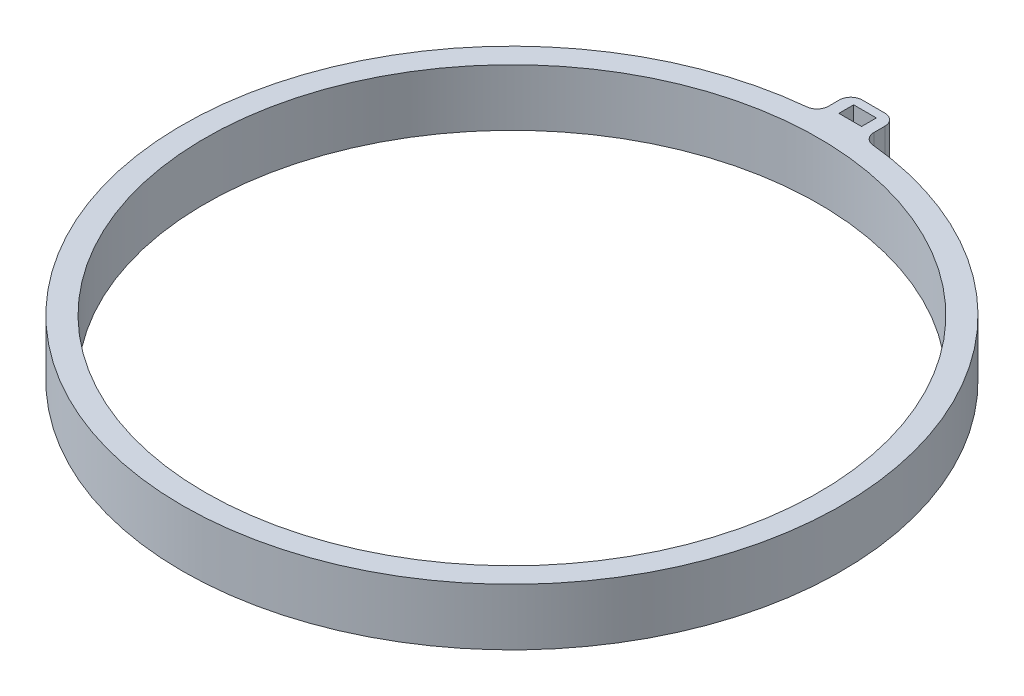
ISO-10303-21;
HEADER;
FILE_DESCRIPTION(('STEP AP214'),'2;1');
FILE_NAME('part.step','',(''),(''),'','','');
FILE_SCHEMA(('AUTOMOTIVE_DESIGN { 1 0 10303 214 1 1 1 1 }'));
ENDSEC;
DATA;
#1=APPLICATION_CONTEXT('core data for automotive mechanical design processes');
#2=APPLICATION_PROTOCOL_DEFINITION('international standard','automotive_design',2000,#1);
#3=PRODUCT_CONTEXT('',#1,'mechanical');
#4=PRODUCT('Part','Part','',(#3));
#5=PRODUCT_RELATED_PRODUCT_CATEGORY('part','',(#4));
#6=PRODUCT_DEFINITION_FORMATION('','',#4);
#7=PRODUCT_DEFINITION_CONTEXT('part definition',#1,'design');
#8=PRODUCT_DEFINITION('design','',#6,#7);
#9=PRODUCT_DEFINITION_SHAPE('','',#8);
#10=(LENGTH_UNIT() NAMED_UNIT(*) SI_UNIT(.MILLI.,.METRE.));
#11=(NAMED_UNIT(*) PLANE_ANGLE_UNIT() SI_UNIT($,.RADIAN.));
#12=(NAMED_UNIT(*) SI_UNIT($,.STERADIAN.) SOLID_ANGLE_UNIT());
#13=UNCERTAINTY_MEASURE_WITH_UNIT(LENGTH_MEASURE(1.E-05),#10,'distance_accuracy_value','');
#14=(GEOMETRIC_REPRESENTATION_CONTEXT(3) GLOBAL_UNCERTAINTY_ASSIGNED_CONTEXT((#13)) GLOBAL_UNIT_ASSIGNED_CONTEXT((#10,
#11,#12)) REPRESENTATION_CONTEXT('',''));
#15=CARTESIAN_POINT('',(0.,0.,0.));
#16=DIRECTION('',(0.,0.,1.));
#17=DIRECTION('',(1.,0.,0.));
#18=AXIS2_PLACEMENT_3D('',#15,#16,#17);
#19=CARTESIAN_POINT('',(0.,5.,0.));
#20=DIRECTION('',(0.,1.,0.));
#21=DIRECTION('',(0.,0.,1.));
#22=AXIS2_PLACEMENT_3D('',#19,#20,#21);
#23=PLANE('',#22);
#24=DIRECTION('',(0.,0.,1.));
#25=VECTOR('',#24,1.);
#26=CARTESIAN_POINT('',(0.999999999999997,5.,-31.0686114081169));
#27=LINE('',#26,#25);
#28=CARTESIAN_POINT('',(0.999999999999997,5.,-31.0686114081169));
#29=VERTEX_POINT('',#28);
#30=CARTESIAN_POINT('',(0.999999999999997,5.,-29.7662195960251));
#31=VERTEX_POINT('',#30);
#32=EDGE_CURVE('E124',#29,#31,#27,.T.);
#33=ORIENTED_EDGE('',*,*,#32,.T.);
#34=DIRECTION('',(-1.,0.,0.));
#35=VECTOR('',#34,1.);
#36=CARTESIAN_POINT('',(-1.,5.,-29.7662195960251));
#37=LINE('',#36,#35);
#38=CARTESIAN_POINT('',(-1.,5.,-29.7662195960251));
#39=VERTEX_POINT('',#38);
#40=EDGE_CURVE('E133',#31,#39,#37,.T.);
#41=ORIENTED_EDGE('',*,*,#40,.T.);
#42=DIRECTION('',(0.,0.,-1.));
#43=VECTOR('',#42,1.);
#44=CARTESIAN_POINT('',(-1.,5.,-31.0686114081169));
#45=LINE('',#44,#43);
#46=CARTESIAN_POINT('',(-1.,5.,-31.0686114081169));
#47=VERTEX_POINT('',#46);
#48=EDGE_CURVE('E49',#39,#47,#45,.T.);
#49=ORIENTED_EDGE('',*,*,#48,.T.);
#50=DIRECTION('',(1.,0.,0.));
#51=VECTOR('',#50,1.);
#52=CARTESIAN_POINT('',(-1.,5.,-31.0686114081169));
#53=LINE('',#52,#51);
#54=EDGE_CURVE('E130',#47,#29,#53,.T.);
#55=ORIENTED_EDGE('',*,*,#54,.T.);
#56=EDGE_LOOP('',(#33,#41,#49,#55));
#57=FACE_BOUND('',#56,.T.);
#58=DIRECTION('',(0.,0.,-1.));
#59=VECTOR('',#58,1.);
#60=CARTESIAN_POINT('',(2.,5.,-31.8144785310325));
#61=LINE('',#60,#59);
#62=CARTESIAN_POINT('',(2.,5.,-29.8496231131986));
#63=VERTEX_POINT('',#62);
#64=CARTESIAN_POINT('',(2.,5.,-30.8144785310325));
#65=VERTEX_POINT('',#64);
#66=EDGE_CURVE('E154',#63,#65,#61,.T.);
#67=ORIENTED_EDGE('',*,*,#66,.T.);
#68=CARTESIAN_POINT('',(0.999999999999997,5.,-30.8144785310325));
#69=DIRECTION('',(0.,1.,0.));
#70=DIRECTION('',(0.,0.,1.));
#71=AXIS2_PLACEMENT_3D('',#68,#69,#70);
#72=CIRCLE('',#71,1.);
#73=CARTESIAN_POINT('',(0.999999999999997,5.,-31.8144785310325));
#74=VERTEX_POINT('',#73);
#75=EDGE_CURVE('E204',#65,#74,#72,.T.);
#76=ORIENTED_EDGE('',*,*,#75,.T.);
#77=DIRECTION('',(-1.,0.,0.));
#78=VECTOR('',#77,1.);
#79=CARTESIAN_POINT('',(-2.,5.,-31.8144785310325));
#80=LINE('',#79,#78);
#81=CARTESIAN_POINT('',(-1.,5.,-31.8144785310325));
#82=VERTEX_POINT('',#81);
#83=EDGE_CURVE('E171',#74,#82,#80,.T.);
#84=ORIENTED_EDGE('',*,*,#83,.T.);
#85=CARTESIAN_POINT('',(-1.,5.,-30.8144785310325));
#86=DIRECTION('',(0.,1.,0.));
#87=DIRECTION('',(0.,0.,1.));
#88=AXIS2_PLACEMENT_3D('',#85,#86,#87);
#89=CIRCLE('',#88,1.);
#90=CARTESIAN_POINT('',(-2.,5.,-30.8144785310325));
#91=VERTEX_POINT('',#90);
#92=EDGE_CURVE('E202',#82,#91,#89,.T.);
#93=ORIENTED_EDGE('',*,*,#92,.T.);
#94=DIRECTION('',(0.,0.,1.));
#95=VECTOR('',#94,1.);
#96=CARTESIAN_POINT('',(-2.,5.,-31.8144785310325));
#97=LINE('',#96,#95);
#98=CARTESIAN_POINT('',(-2.,5.,-29.8496231131986));
#99=VERTEX_POINT('',#98);
#100=EDGE_CURVE('E162',#91,#99,#97,.T.);
#101=ORIENTED_EDGE('',*,*,#100,.T.);
#102=CARTESIAN_POINT('',(-3.,5.,-29.8496231131986));
#103=DIRECTION('',(0.,1.,0.));
#104=DIRECTION('',(0.,0.,1.));
#105=AXIS2_PLACEMENT_3D('',#102,#103,#104);
#106=CIRCLE('',#105,1.);
#107=CARTESIAN_POINT('',(-2.9,5.,-28.854635676092));
#108=VERTEX_POINT('',#107);
#109=EDGE_CURVE('E11',#99,#108,#106,.F.);
#110=ORIENTED_EDGE('',*,*,#109,.T.);
#111=CARTESIAN_POINT('',(0.,5.,0.));
#112=DIRECTION('',(0.,1.,0.));
#113=DIRECTION('',(0.,0.,1.));
#114=AXIS2_PLACEMENT_3D('',#111,#112,#113);
#115=CIRCLE('',#114,29.);
#116=CARTESIAN_POINT('',(2.9,5.,-28.854635676092));
#117=VERTEX_POINT('',#116);
#118=EDGE_CURVE('E182',#108,#117,#115,.T.);
#119=ORIENTED_EDGE('',*,*,#118,.T.);
#120=CARTESIAN_POINT('',(3.,5.,-29.8496231131986));
#121=DIRECTION('',(0.,1.,0.));
#122=DIRECTION('',(0.,0.,1.));
#123=AXIS2_PLACEMENT_3D('',#120,#121,#122);
#124=CIRCLE('',#123,1.);
#125=EDGE_CURVE('E215',#117,#63,#124,.F.);
#126=ORIENTED_EDGE('',*,*,#125,.T.);
#127=EDGE_LOOP('',(#67,#76,#84,#93,#101,#110,#119,#126));
#128=FACE_BOUND('',#127,.T.);
#129=CARTESIAN_POINT('',(0.,5.,0.));
#130=DIRECTION('',(0.,1.,0.));
#131=DIRECTION('',(0.,0.,1.));
#132=AXIS2_PLACEMENT_3D('',#129,#130,#131);
#133=CIRCLE('',#132,27.);
#134=CARTESIAN_POINT('',(0.,5.,27.));
#135=VERTEX_POINT('',#134);
#136=EDGE_CURVE('E176',#135,#135,#133,.T.);
#137=ORIENTED_EDGE('',*,*,#136,.F.);
#138=EDGE_LOOP('',(#137));
#139=FACE_BOUND('',#138,.T.);
#140=ADVANCED_FACE('F34',(#57,#128,#139),#23,.T.);
#141=CARTESIAN_POINT('',(0.,0.,0.));
#142=DIRECTION('',(0.,1.,0.));
#143=DIRECTION('',(0.,0.,1.));
#144=AXIS2_PLACEMENT_3D('',#141,#142,#143);
#145=PLANE('',#144);
#146=DIRECTION('',(-1.,0.,0.));
#147=VECTOR('',#146,1.);
#148=CARTESIAN_POINT('',(-1.,0.,-29.7662195960251));
#149=LINE('',#148,#147);
#150=CARTESIAN_POINT('',(0.999999999999997,0.,-29.7662195960251));
#151=VERTEX_POINT('',#150);
#152=CARTESIAN_POINT('',(-1.,0.,-29.7662195960251));
#153=VERTEX_POINT('',#152);
#154=EDGE_CURVE('E148',#151,#153,#149,.T.);
#155=ORIENTED_EDGE('',*,*,#154,.F.);
#156=DIRECTION('',(0.,0.,1.));
#157=VECTOR('',#156,1.);
#158=CARTESIAN_POINT('',(0.999999999999997,0.,-31.0686114081169));
#159=LINE('',#158,#157);
#160=CARTESIAN_POINT('',(0.999999999999997,0.,-31.0686114081169));
#161=VERTEX_POINT('',#160);
#162=EDGE_CURVE('E57',#161,#151,#159,.T.);
#163=ORIENTED_EDGE('',*,*,#162,.F.);
#164=DIRECTION('',(1.,0.,0.));
#165=VECTOR('',#164,1.);
#166=CARTESIAN_POINT('',(-1.,0.,-31.0686114081169));
#167=LINE('',#166,#165);
#168=CARTESIAN_POINT('',(-1.,0.,-31.0686114081169));
#169=VERTEX_POINT('',#168);
#170=EDGE_CURVE('E139',#169,#161,#167,.T.);
#171=ORIENTED_EDGE('',*,*,#170,.F.);
#172=DIRECTION('',(0.,0.,-1.));
#173=VECTOR('',#172,1.);
#174=CARTESIAN_POINT('',(-1.,0.,-31.0686114081169));
#175=LINE('',#174,#173);
#176=EDGE_CURVE('E142',#153,#169,#175,.T.);
#177=ORIENTED_EDGE('',*,*,#176,.F.);
#178=EDGE_LOOP('',(#155,#163,#171,#177));
#179=FACE_BOUND('',#178,.T.);
#180=DIRECTION('',(-1.,0.,0.));
#181=VECTOR('',#180,1.);
#182=CARTESIAN_POINT('',(-2.,0.,-31.8144785310325));
#183=LINE('',#182,#181);
#184=CARTESIAN_POINT('',(0.999999999999997,0.,-31.8144785310325));
#185=VERTEX_POINT('',#184);
#186=CARTESIAN_POINT('',(-1.,0.,-31.8144785310325));
#187=VERTEX_POINT('',#186);
#188=EDGE_CURVE('E161',#185,#187,#183,.T.);
#189=ORIENTED_EDGE('',*,*,#188,.F.);
#190=CARTESIAN_POINT('',(0.999999999999997,0.,-30.8144785310325));
#191=DIRECTION('',(0.,1.,0.));
#192=DIRECTION('',(0.,0.,1.));
#193=AXIS2_PLACEMENT_3D('',#190,#191,#192);
#194=CIRCLE('',#193,1.);
#195=CARTESIAN_POINT('',(2.,0.,-30.8144785310325));
#196=VERTEX_POINT('',#195);
#197=EDGE_CURVE('E213',#185,#196,#194,.F.);
#198=ORIENTED_EDGE('',*,*,#197,.T.);
#199=DIRECTION('',(0.,0.,-1.));
#200=VECTOR('',#199,1.);
#201=CARTESIAN_POINT('',(2.,0.,-31.8144785310325));
#202=LINE('',#201,#200);
#203=CARTESIAN_POINT('',(2.,0.,-29.8496231131986));
#204=VERTEX_POINT('',#203);
#205=EDGE_CURVE('E158',#204,#196,#202,.T.);
#206=ORIENTED_EDGE('',*,*,#205,.F.);
#207=CARTESIAN_POINT('',(3.,0.,-29.8496231131986));
#208=DIRECTION('',(0.,1.,0.));
#209=DIRECTION('',(0.,0.,1.));
#210=AXIS2_PLACEMENT_3D('',#207,#208,#209);
#211=CIRCLE('',#210,1.);
#212=CARTESIAN_POINT('',(2.9,0.,-28.854635676092));
#213=VERTEX_POINT('',#212);
#214=EDGE_CURVE('E217',#204,#213,#211,.T.);
#215=ORIENTED_EDGE('',*,*,#214,.T.);
#216=CARTESIAN_POINT('',(0.,0.,0.));
#217=DIRECTION('',(0.,1.,0.));
#218=DIRECTION('',(0.,0.,1.));
#219=AXIS2_PLACEMENT_3D('',#216,#217,#218);
#220=CIRCLE('',#219,29.);
#221=CARTESIAN_POINT('',(-2.9,0.,-28.854635676092));
#222=VERTEX_POINT('',#221);
#223=EDGE_CURVE('E179',#222,#213,#220,.T.);
#224=ORIENTED_EDGE('',*,*,#223,.F.);
#225=CARTESIAN_POINT('',(-3.,0.,-29.8496231131986));
#226=DIRECTION('',(0.,1.,0.));
#227=DIRECTION('',(0.,0.,1.));
#228=AXIS2_PLACEMENT_3D('',#225,#226,#227);
#229=CIRCLE('',#228,1.);
#230=CARTESIAN_POINT('',(-2.,0.,-29.8496231131986));
#231=VERTEX_POINT('',#230);
#232=EDGE_CURVE('E42',#222,#231,#229,.T.);
#233=ORIENTED_EDGE('',*,*,#232,.T.);
#234=DIRECTION('',(0.,0.,1.));
#235=VECTOR('',#234,1.);
#236=CARTESIAN_POINT('',(-2.,0.,-31.8144785310325));
#237=LINE('',#236,#235);
#238=CARTESIAN_POINT('',(-2.,0.,-30.8144785310325));
#239=VERTEX_POINT('',#238);
#240=EDGE_CURVE('E165',#239,#231,#237,.T.);
#241=ORIENTED_EDGE('',*,*,#240,.F.);
#242=CARTESIAN_POINT('',(-1.,0.,-30.8144785310325));
#243=DIRECTION('',(0.,1.,0.));
#244=DIRECTION('',(0.,0.,1.));
#245=AXIS2_PLACEMENT_3D('',#242,#243,#244);
#246=CIRCLE('',#245,1.);
#247=EDGE_CURVE('E211',#239,#187,#246,.F.);
#248=ORIENTED_EDGE('',*,*,#247,.T.);
#249=EDGE_LOOP('',(#189,#198,#206,#215,#224,#233,#241,#248));
#250=FACE_BOUND('',#249,.T.);
#251=CARTESIAN_POINT('',(0.,0.,0.));
#252=DIRECTION('',(0.,1.,0.));
#253=DIRECTION('',(0.,0.,1.));
#254=AXIS2_PLACEMENT_3D('',#251,#252,#253);
#255=CIRCLE('',#254,27.);
#256=CARTESIAN_POINT('',(0.,0.,27.));
#257=VERTEX_POINT('',#256);
#258=EDGE_CURVE('E168',#257,#257,#255,.T.);
#259=ORIENTED_EDGE('',*,*,#258,.T.);
#260=EDGE_LOOP('',(#259));
#261=FACE_BOUND('',#260,.T.);
#262=ADVANCED_FACE('F222',(#179,#250,#261),#145,.F.);
#263=CARTESIAN_POINT('',(0.,5.,0.));
#264=DIRECTION('',(0.,-1.,0.));
#265=DIRECTION('',(0.,0.,-1.));
#266=AXIS2_PLACEMENT_3D('',#263,#264,#265);
#267=CYLINDRICAL_SURFACE('',#266,29.);
#268=ORIENTED_EDGE('',*,*,#223,.T.);
#269=DIRECTION('',(0.,-1.,0.));
#270=VECTOR('',#269,1.);
#271=CARTESIAN_POINT('',(2.9,5.,-28.854635676092));
#272=LINE('',#271,#270);
#273=EDGE_CURVE('E190',#213,#117,#272,.F.);
#274=ORIENTED_EDGE('',*,*,#273,.T.);
#275=ORIENTED_EDGE('',*,*,#118,.F.);
#276=DIRECTION('',(0.,-1.,0.));
#277=VECTOR('',#276,1.);
#278=CARTESIAN_POINT('',(-2.9,5.,-28.854635676092));
#279=LINE('',#278,#277);
#280=EDGE_CURVE('E185',#108,#222,#279,.T.);
#281=ORIENTED_EDGE('',*,*,#280,.T.);
#282=EDGE_LOOP('',(#268,#274,#275,#281));
#283=FACE_BOUND('',#282,.T.);
#284=ADVANCED_FACE('F237',(#283),#267,.T.);
#285=CARTESIAN_POINT('',(0.,5.,0.));
#286=DIRECTION('',(0.,-1.,0.));
#287=DIRECTION('',(0.,0.,-1.));
#288=AXIS2_PLACEMENT_3D('',#285,#286,#287);
#289=CYLINDRICAL_SURFACE('',#288,27.);
#290=ORIENTED_EDGE('',*,*,#136,.T.);
#291=EDGE_LOOP('',(#290));
#292=FACE_BOUND('',#291,.T.);
#293=ORIENTED_EDGE('',*,*,#258,.F.);
#294=EDGE_LOOP('',(#293));
#295=FACE_BOUND('',#294,.T.);
#296=ADVANCED_FACE('F272',(#292,#295),#289,.F.);
#297=CARTESIAN_POINT('',(2.,0.,-31.8144785310325));
#298=DIRECTION('',(1.,0.,0.));
#299=DIRECTION('',(0.,0.,-1.));
#300=AXIS2_PLACEMENT_3D('',#297,#298,#299);
#301=PLANE('',#300);
#302=ORIENTED_EDGE('',*,*,#66,.F.);
#303=DIRECTION('',(0.,-1.,0.));
#304=VECTOR('',#303,1.);
#305=CARTESIAN_POINT('',(2.,0.,-29.8496231131986));
#306=LINE('',#305,#304);
#307=EDGE_CURVE('E196',#63,#204,#306,.T.);
#308=ORIENTED_EDGE('',*,*,#307,.T.);
#309=ORIENTED_EDGE('',*,*,#205,.T.);
#310=DIRECTION('',(0.,1.,0.));
#311=VECTOR('',#310,1.);
#312=CARTESIAN_POINT('',(2.,0.,-30.8144785310325));
#313=LINE('',#312,#311);
#314=EDGE_CURVE('E193',#196,#65,#313,.T.);
#315=ORIENTED_EDGE('',*,*,#314,.T.);
#316=EDGE_LOOP('',(#302,#308,#309,#315));
#317=FACE_BOUND('',#316,.T.);
#318=ADVANCED_FACE('F245',(#317),#301,.T.);
#319=CARTESIAN_POINT('',(-2.,0.,-31.8144785310325));
#320=DIRECTION('',(-1.,0.,0.));
#321=DIRECTION('',(0.,0.,1.));
#322=AXIS2_PLACEMENT_3D('',#319,#320,#321);
#323=PLANE('',#322);
#324=ORIENTED_EDGE('',*,*,#240,.T.);
#325=DIRECTION('',(0.,-1.,0.));
#326=VECTOR('',#325,1.);
#327=CARTESIAN_POINT('',(-2.,0.,-29.8496231131986));
#328=LINE('',#327,#326);
#329=EDGE_CURVE('E200',#231,#99,#328,.F.);
#330=ORIENTED_EDGE('',*,*,#329,.T.);
#331=ORIENTED_EDGE('',*,*,#100,.F.);
#332=DIRECTION('',(0.,1.,0.));
#333=VECTOR('',#332,1.);
#334=CARTESIAN_POINT('',(-2.,0.,-30.8144785310325));
#335=LINE('',#334,#333);
#336=EDGE_CURVE('E198',#91,#239,#335,.F.);
#337=ORIENTED_EDGE('',*,*,#336,.T.);
#338=EDGE_LOOP('',(#324,#330,#331,#337));
#339=FACE_BOUND('',#338,.T.);
#340=ADVANCED_FACE('F229',(#339),#323,.T.);
#341=CARTESIAN_POINT('',(-2.,0.,-31.8144785310325));
#342=DIRECTION('',(0.,0.,-1.));
#343=DIRECTION('',(-1.,0.,0.));
#344=AXIS2_PLACEMENT_3D('',#341,#342,#343);
#345=PLANE('',#344);
#346=ORIENTED_EDGE('',*,*,#83,.F.);
#347=DIRECTION('',(0.,1.,0.));
#348=VECTOR('',#347,1.);
#349=CARTESIAN_POINT('',(0.999999999999997,0.,-31.8144785310325));
#350=LINE('',#349,#348);
#351=EDGE_CURVE('E209',#74,#185,#350,.F.);
#352=ORIENTED_EDGE('',*,*,#351,.T.);
#353=ORIENTED_EDGE('',*,*,#188,.T.);
#354=DIRECTION('',(0.,1.,0.));
#355=VECTOR('',#354,1.);
#356=CARTESIAN_POINT('',(-1.,0.,-31.8144785310325));
#357=LINE('',#356,#355);
#358=EDGE_CURVE('E206',#187,#82,#357,.T.);
#359=ORIENTED_EDGE('',*,*,#358,.T.);
#360=EDGE_LOOP('',(#346,#352,#353,#359));
#361=FACE_BOUND('',#360,.T.);
#362=ADVANCED_FACE('F254',(#361),#345,.T.);
#363=CARTESIAN_POINT('',(3.,5.,-29.8496231131986));
#364=DIRECTION('',(0.,-1.,0.));
#365=DIRECTION('',(0.,0.,-1.));
#366=AXIS2_PLACEMENT_3D('',#363,#364,#365);
#367=CYLINDRICAL_SURFACE('',#366,1.);
#368=ORIENTED_EDGE('',*,*,#214,.F.);
#369=ORIENTED_EDGE('',*,*,#307,.F.);
#370=ORIENTED_EDGE('',*,*,#125,.F.);
#371=ORIENTED_EDGE('',*,*,#273,.F.);
#372=EDGE_LOOP('',(#368,#369,#370,#371));
#373=FACE_BOUND('',#372,.T.);
#374=ADVANCED_FACE('F241',(#373),#367,.F.);
#375=CARTESIAN_POINT('',(-3.,5.,-29.8496231131986));
#376=DIRECTION('',(0.,-1.,0.));
#377=DIRECTION('',(0.,0.,-1.));
#378=AXIS2_PLACEMENT_3D('',#375,#376,#377);
#379=CYLINDRICAL_SURFACE('',#378,1.);
#380=ORIENTED_EDGE('',*,*,#109,.F.);
#381=ORIENTED_EDGE('',*,*,#329,.F.);
#382=ORIENTED_EDGE('',*,*,#232,.F.);
#383=ORIENTED_EDGE('',*,*,#280,.F.);
#384=EDGE_LOOP('',(#380,#381,#382,#383));
#385=FACE_BOUND('',#384,.T.);
#386=ADVANCED_FACE('F233',(#385),#379,.F.);
#387=CARTESIAN_POINT('',(0.999999999999997,0.,-30.8144785310325));
#388=DIRECTION('',(0.,1.,0.));
#389=DIRECTION('',(0.,0.,1.));
#390=AXIS2_PLACEMENT_3D('',#387,#388,#389);
#391=CYLINDRICAL_SURFACE('',#390,1.);
#392=ORIENTED_EDGE('',*,*,#197,.F.);
#393=ORIENTED_EDGE('',*,*,#351,.F.);
#394=ORIENTED_EDGE('',*,*,#75,.F.);
#395=ORIENTED_EDGE('',*,*,#314,.F.);
#396=EDGE_LOOP('',(#392,#393,#394,#395));
#397=FACE_BOUND('',#396,.T.);
#398=ADVANCED_FACE('F250',(#397),#391,.T.);
#399=CARTESIAN_POINT('',(-1.,0.,-30.8144785310325));
#400=DIRECTION('',(0.,1.,0.));
#401=DIRECTION('',(0.,0.,1.));
#402=AXIS2_PLACEMENT_3D('',#399,#400,#401);
#403=CYLINDRICAL_SURFACE('',#402,1.);
#404=ORIENTED_EDGE('',*,*,#247,.F.);
#405=ORIENTED_EDGE('',*,*,#336,.F.);
#406=ORIENTED_EDGE('',*,*,#92,.F.);
#407=ORIENTED_EDGE('',*,*,#358,.F.);
#408=EDGE_LOOP('',(#404,#405,#406,#407));
#409=FACE_BOUND('',#408,.T.);
#410=ADVANCED_FACE('F36',(#409),#403,.T.);
#411=CARTESIAN_POINT('',(0.999999999999997,5.,-31.0686114081169));
#412=DIRECTION('',(1.,0.,0.));
#413=DIRECTION('',(0.,0.,-1.));
#414=AXIS2_PLACEMENT_3D('',#411,#412,#413);
#415=PLANE('',#414);
#416=ORIENTED_EDGE('',*,*,#162,.T.);
#417=DIRECTION('',(0.,-1.,0.));
#418=VECTOR('',#417,1.);
#419=CARTESIAN_POINT('',(0.999999999999997,5.,-29.7662195960251));
#420=LINE('',#419,#418);
#421=EDGE_CURVE('E120',#31,#151,#420,.T.);
#422=ORIENTED_EDGE('',*,*,#421,.F.);
#423=ORIENTED_EDGE('',*,*,#32,.F.);
#424=DIRECTION('',(0.,-1.,0.));
#425=VECTOR('',#424,1.);
#426=CARTESIAN_POINT('',(0.999999999999997,5.,-31.0686114081169));
#427=LINE('',#426,#425);
#428=EDGE_CURVE('E152',#29,#161,#427,.T.);
#429=ORIENTED_EDGE('',*,*,#428,.T.);
#430=EDGE_LOOP('',(#416,#422,#423,#429));
#431=FACE_BOUND('',#430,.T.);
#432=ADVANCED_FACE('F122',(#431),#415,.F.);
#433=CARTESIAN_POINT('',(-1.,5.,-31.0686114081169));
#434=DIRECTION('',(0.,0.,-1.));
#435=DIRECTION('',(-1.,0.,0.));
#436=AXIS2_PLACEMENT_3D('',#433,#434,#435);
#437=PLANE('',#436);
#438=ORIENTED_EDGE('',*,*,#170,.T.);
#439=ORIENTED_EDGE('',*,*,#428,.F.);
#440=ORIENTED_EDGE('',*,*,#54,.F.);
#441=DIRECTION('',(0.,-1.,0.));
#442=VECTOR('',#441,1.);
#443=CARTESIAN_POINT('',(-1.,5.,-31.0686114081169));
#444=LINE('',#443,#442);
#445=EDGE_CURVE('E155',#47,#169,#444,.T.);
#446=ORIENTED_EDGE('',*,*,#445,.T.);
#447=EDGE_LOOP('',(#438,#439,#440,#446));
#448=FACE_BOUND('',#447,.T.);
#449=ADVANCED_FACE('F262',(#448),#437,.F.);
#450=CARTESIAN_POINT('',(-1.,5.,-31.0686114081169));
#451=DIRECTION('',(-1.,0.,0.));
#452=DIRECTION('',(0.,0.,1.));
#453=AXIS2_PLACEMENT_3D('',#450,#451,#452);
#454=PLANE('',#453);
#455=ORIENTED_EDGE('',*,*,#176,.T.);
#456=ORIENTED_EDGE('',*,*,#445,.F.);
#457=ORIENTED_EDGE('',*,*,#48,.F.);
#458=DIRECTION('',(0.,-1.,0.));
#459=VECTOR('',#458,1.);
#460=CARTESIAN_POINT('',(-1.,5.,-29.7662195960251));
#461=LINE('',#460,#459);
#462=EDGE_CURVE('E129',#39,#153,#461,.T.);
#463=ORIENTED_EDGE('',*,*,#462,.T.);
#464=EDGE_LOOP('',(#455,#456,#457,#463));
#465=FACE_BOUND('',#464,.T.);
#466=ADVANCED_FACE('F322',(#465),#454,.F.);
#467=CARTESIAN_POINT('',(-1.,5.,-29.7662195960251));
#468=DIRECTION('',(0.,0.,1.));
#469=DIRECTION('',(1.,0.,0.));
#470=AXIS2_PLACEMENT_3D('',#467,#468,#469);
#471=PLANE('',#470);
#472=ORIENTED_EDGE('',*,*,#154,.T.);
#473=ORIENTED_EDGE('',*,*,#462,.F.);
#474=ORIENTED_EDGE('',*,*,#40,.F.);
#475=ORIENTED_EDGE('',*,*,#421,.T.);
#476=EDGE_LOOP('',(#472,#473,#474,#475));
#477=FACE_BOUND('',#476,.T.);
#478=ADVANCED_FACE('F134',(#477),#471,.F.);
#479=CLOSED_SHELL('',(#140,#262,#284,#296,#318,#340,#362,#374,#386,#398,#410,#432,#449,#466,#478));
#480=MANIFOLD_SOLID_BREP('B2',#479);
#481=ADVANCED_BREP_SHAPE_REPRESENTATION('',(#18,#480),#14);
#482=SHAPE_DEFINITION_REPRESENTATION(#9,#481);
ENDSEC;
END-ISO-10303-21;
